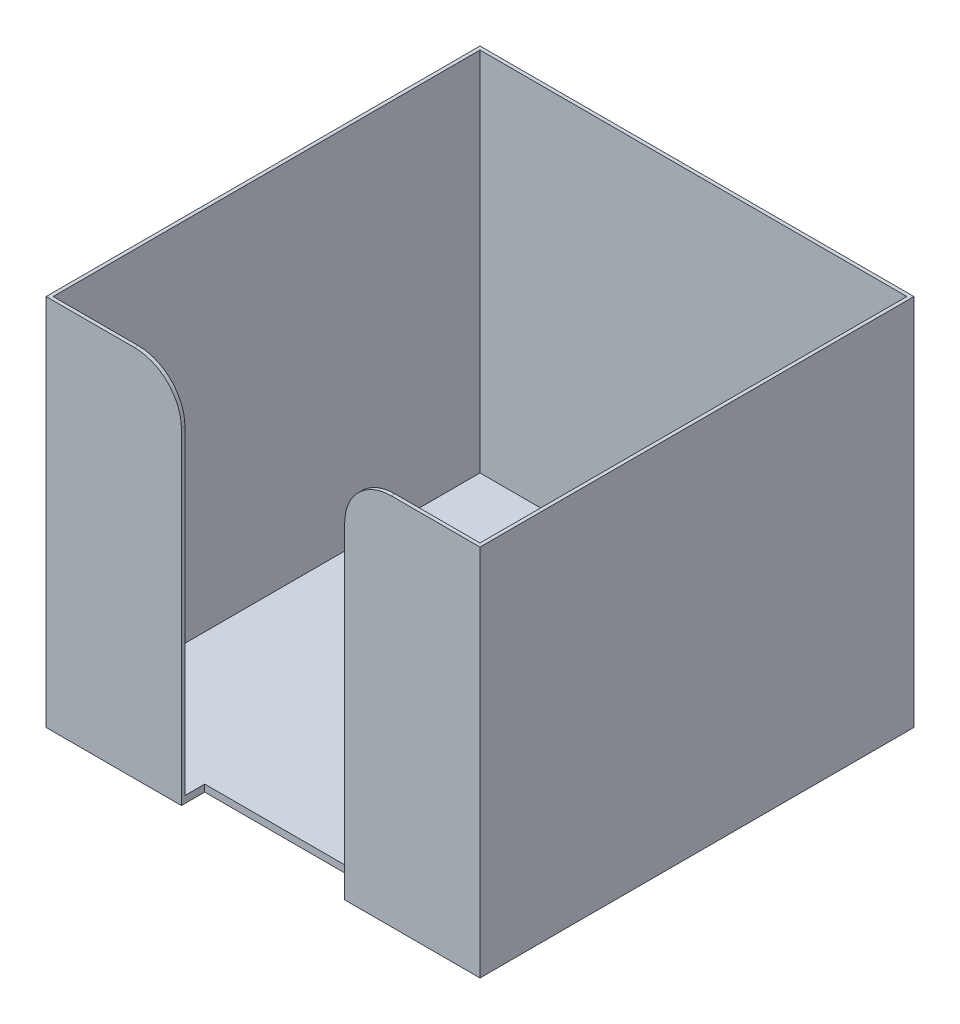
ISO-10303-21;
HEADER;
FILE_DESCRIPTION(('STEP AP214'),'2;1');
FILE_NAME('part.step','',(''),(''),'','','');
FILE_SCHEMA(('AUTOMOTIVE_DESIGN { 1 0 10303 214 1 1 1 1 }'));
ENDSEC;
DATA;
#1=APPLICATION_CONTEXT('core data for automotive mechanical design processes');
#2=APPLICATION_PROTOCOL_DEFINITION('international standard','automotive_design',2000,#1);
#3=PRODUCT_CONTEXT('',#1,'mechanical');
#4=PRODUCT('Part','Part','',(#3));
#5=PRODUCT_RELATED_PRODUCT_CATEGORY('part','',(#4));
#6=PRODUCT_DEFINITION_FORMATION('','',#4);
#7=PRODUCT_DEFINITION_CONTEXT('part definition',#1,'design');
#8=PRODUCT_DEFINITION('design','',#6,#7);
#9=PRODUCT_DEFINITION_SHAPE('','',#8);
#10=(LENGTH_UNIT() NAMED_UNIT(*) SI_UNIT(.MILLI.,.METRE.));
#11=(NAMED_UNIT(*) PLANE_ANGLE_UNIT() SI_UNIT($,.RADIAN.));
#12=(NAMED_UNIT(*) SI_UNIT($,.STERADIAN.) SOLID_ANGLE_UNIT());
#13=UNCERTAINTY_MEASURE_WITH_UNIT(LENGTH_MEASURE(1.E-05),#10,'distance_accuracy_value','');
#14=(GEOMETRIC_REPRESENTATION_CONTEXT(3) GLOBAL_UNCERTAINTY_ASSIGNED_CONTEXT((#13)) GLOBAL_UNIT_ASSIGNED_CONTEXT((#10,
#11,#12)) REPRESENTATION_CONTEXT('',''));
#15=CARTESIAN_POINT('',(0.,0.,0.));
#16=DIRECTION('',(0.,0.,1.));
#17=DIRECTION('',(1.,0.,0.));
#18=AXIS2_PLACEMENT_3D('',#15,#16,#17);
#19=CARTESIAN_POINT('',(-46.5,80.,46.5));
#20=DIRECTION('',(0.,0.,-1.));
#21=DIRECTION('',(-1.,0.,0.));
#22=AXIS2_PLACEMENT_3D('',#19,#20,#21);
#23=PLANE('',#22);
#24=DIRECTION('',(0.,-1.,0.));
#25=VECTOR('',#24,1.);
#26=CARTESIAN_POINT('',(-17.5,80.,46.5));
#27=LINE('',#26,#25);
#28=CARTESIAN_POINT('',(-17.5,70.,46.5));
#29=VERTEX_POINT('',#28);
#30=CARTESIAN_POINT('',(-17.5,0.,46.5));
#31=VERTEX_POINT('',#30);
#32=EDGE_CURVE('E172',#29,#31,#27,.T.);
#33=ORIENTED_EDGE('',*,*,#32,.F.);
#34=CARTESIAN_POINT('',(-27.5,70.,46.5));
#35=DIRECTION('',(0.,0.,-1.));
#36=DIRECTION('',(-1.,0.,0.));
#37=AXIS2_PLACEMENT_3D('',#34,#35,#36);
#38=CIRCLE('',#37,10.);
#39=CARTESIAN_POINT('',(-27.5,80.,46.5));
#40=VERTEX_POINT('',#39);
#41=EDGE_CURVE('E303',#29,#40,#38,.F.);
#42=ORIENTED_EDGE('',*,*,#41,.T.);
#43=DIRECTION('',(1.,0.,0.));
#44=VECTOR('',#43,1.);
#45=CARTESIAN_POINT('',(-46.5,80.,46.5));
#46=LINE('',#45,#44);
#47=CARTESIAN_POINT('',(-46.5,80.,46.5));
#48=VERTEX_POINT('',#47);
#49=EDGE_CURVE('E247',#48,#40,#46,.T.);
#50=ORIENTED_EDGE('',*,*,#49,.F.);
#51=DIRECTION('',(0.,-1.,0.));
#52=VECTOR('',#51,1.);
#53=CARTESIAN_POINT('',(-46.5,80.,46.5));
#54=LINE('',#53,#52);
#55=CARTESIAN_POINT('',(-46.5,0.,46.5));
#56=VERTEX_POINT('',#55);
#57=EDGE_CURVE('E263',#48,#56,#54,.T.);
#58=ORIENTED_EDGE('',*,*,#57,.T.);
#59=DIRECTION('',(1.,0.,0.));
#60=VECTOR('',#59,1.);
#61=CARTESIAN_POINT('',(-46.5,0.,46.5));
#62=LINE('',#61,#60);
#63=EDGE_CURVE('E264',#56,#31,#62,.T.);
#64=ORIENTED_EDGE('',*,*,#63,.T.);
#65=EDGE_LOOP('',(#33,#42,#50,#58,#64));
#66=FACE_BOUND('',#65,.T.);
#67=ADVANCED_FACE('F39',(#66),#23,.F.);
#68=CARTESIAN_POINT('',(45.75,1.5,45.75));
#69=DIRECTION('',(0.,0.,1.));
#70=DIRECTION('',(1.,0.,0.));
#71=AXIS2_PLACEMENT_3D('',#68,#69,#70);
#72=PLANE('',#71);
#73=DIRECTION('',(1.,0.,0.));
#74=VECTOR('',#73,1.);
#75=CARTESIAN_POINT('',(45.75,80.,45.75));
#76=LINE('',#75,#74);
#77=CARTESIAN_POINT('',(-45.75,80.,45.75));
#78=VERTEX_POINT('',#77);
#79=CARTESIAN_POINT('',(-27.5,80.,45.75));
#80=VERTEX_POINT('',#79);
#81=EDGE_CURVE('E222',#78,#80,#76,.T.);
#82=ORIENTED_EDGE('',*,*,#81,.T.);
#83=CARTESIAN_POINT('',(-27.5,70.,45.75));
#84=DIRECTION('',(0.,0.,1.));
#85=DIRECTION('',(1.,0.,0.));
#86=AXIS2_PLACEMENT_3D('',#83,#84,#85);
#87=CIRCLE('',#86,10.);
#88=CARTESIAN_POINT('',(-17.5,70.,45.75));
#89=VERTEX_POINT('',#88);
#90=EDGE_CURVE('E309',#80,#89,#87,.F.);
#91=ORIENTED_EDGE('',*,*,#90,.T.);
#92=DIRECTION('',(0.,-1.,0.));
#93=VECTOR('',#92,1.);
#94=CARTESIAN_POINT('',(-17.5,1.49999999999999,45.75));
#95=LINE('',#94,#93);
#96=CARTESIAN_POINT('',(-17.5,1.5,45.75));
#97=VERTEX_POINT('',#96);
#98=EDGE_CURVE('E196',#89,#97,#95,.T.);
#99=ORIENTED_EDGE('',*,*,#98,.T.);
#100=DIRECTION('',(1.,0.,0.));
#101=VECTOR('',#100,1.);
#102=CARTESIAN_POINT('',(45.75,1.5,45.75));
#103=LINE('',#102,#101);
#104=CARTESIAN_POINT('',(-45.75,1.5,45.75));
#105=VERTEX_POINT('',#104);
#106=EDGE_CURVE('E206',#105,#97,#103,.T.);
#107=ORIENTED_EDGE('',*,*,#106,.F.);
#108=DIRECTION('',(0.,1.,0.));
#109=VECTOR('',#108,1.);
#110=CARTESIAN_POINT('',(-45.75,1.5,45.75));
#111=LINE('',#110,#109);
#112=EDGE_CURVE('E218',#105,#78,#111,.T.);
#113=ORIENTED_EDGE('',*,*,#112,.T.);
#114=EDGE_LOOP('',(#82,#91,#99,#107,#113));
#115=FACE_BOUND('',#114,.T.);
#116=ADVANCED_FACE('F368',(#115),#72,.F.);
#117=CARTESIAN_POINT('',(27.5,80.,46.5));
#118=VERTEX_POINT('',#117);
#119=CARTESIAN_POINT('',(46.5,80.,46.5));
#120=VERTEX_POINT('',#119);
#121=EDGE_CURVE('E252',#118,#120,#46,.T.);
#122=ORIENTED_EDGE('',*,*,#121,.F.);
#123=CARTESIAN_POINT('',(27.5,70.,46.5));
#124=DIRECTION('',(0.,0.,-1.));
#125=DIRECTION('',(-1.,0.,0.));
#126=AXIS2_PLACEMENT_3D('',#123,#124,#125);
#127=CIRCLE('',#126,10.);
#128=CARTESIAN_POINT('',(17.5,70.,46.5));
#129=VERTEX_POINT('',#128);
#130=EDGE_CURVE('E62',#118,#129,#127,.F.);
#131=ORIENTED_EDGE('',*,*,#130,.T.);
#132=DIRECTION('',(0.,1.,0.));
#133=VECTOR('',#132,1.);
#134=CARTESIAN_POINT('',(17.5,80.,46.5));
#135=LINE('',#134,#133);
#136=CARTESIAN_POINT('',(17.5,0.,46.5));
#137=VERTEX_POINT('',#136);
#138=EDGE_CURVE('E164',#137,#129,#135,.T.);
#139=ORIENTED_EDGE('',*,*,#138,.F.);
#140=CARTESIAN_POINT('',(46.5,0.,46.5));
#141=VERTEX_POINT('',#140);
#142=EDGE_CURVE('E236',#137,#141,#62,.T.);
#143=ORIENTED_EDGE('',*,*,#142,.T.);
#144=DIRECTION('',(0.,-1.,0.));
#145=VECTOR('',#144,1.);
#146=CARTESIAN_POINT('',(46.5,80.,46.5));
#147=LINE('',#146,#145);
#148=EDGE_CURVE('E287',#120,#141,#147,.T.);
#149=ORIENTED_EDGE('',*,*,#148,.F.);
#150=EDGE_LOOP('',(#122,#131,#139,#143,#149));
#151=FACE_BOUND('',#150,.T.);
#152=ADVANCED_FACE('F348',(#151),#23,.F.);
#153=CARTESIAN_POINT('',(46.5,80.,46.5));
#154=DIRECTION('',(-1.,0.,0.));
#155=DIRECTION('',(0.,0.,1.));
#156=AXIS2_PLACEMENT_3D('',#153,#154,#155);
#157=PLANE('',#156);
#158=DIRECTION('',(0.,0.,-1.));
#159=VECTOR('',#158,1.);
#160=CARTESIAN_POINT('',(46.5,0.,46.5));
#161=LINE('',#160,#159);
#162=CARTESIAN_POINT('',(46.5,0.,-46.5));
#163=VERTEX_POINT('',#162);
#164=EDGE_CURVE('E267',#141,#163,#161,.T.);
#165=ORIENTED_EDGE('',*,*,#164,.T.);
#166=DIRECTION('',(0.,-1.,0.));
#167=VECTOR('',#166,1.);
#168=CARTESIAN_POINT('',(46.5,80.,-46.5));
#169=LINE('',#168,#167);
#170=CARTESIAN_POINT('',(46.5,80.,-46.5));
#171=VERTEX_POINT('',#170);
#172=EDGE_CURVE('E284',#171,#163,#169,.T.);
#173=ORIENTED_EDGE('',*,*,#172,.F.);
#174=DIRECTION('',(0.,0.,-1.));
#175=VECTOR('',#174,1.);
#176=CARTESIAN_POINT('',(46.5,80.,46.5));
#177=LINE('',#176,#175);
#178=EDGE_CURVE('E251',#120,#171,#177,.T.);
#179=ORIENTED_EDGE('',*,*,#178,.F.);
#180=ORIENTED_EDGE('',*,*,#148,.T.);
#181=EDGE_LOOP('',(#165,#173,#179,#180));
#182=FACE_BOUND('',#181,.T.);
#183=ADVANCED_FACE('F351',(#182),#157,.F.);
#184=CARTESIAN_POINT('',(-46.5,80.,-46.5));
#185=DIRECTION('',(0.,0.,-1.));
#186=DIRECTION('',(-1.,0.,0.));
#187=AXIS2_PLACEMENT_3D('',#184,#185,#186);
#188=PLANE('',#187);
#189=DIRECTION('',(1.,0.,0.));
#190=VECTOR('',#189,1.);
#191=CARTESIAN_POINT('',(-46.5,0.,-46.5));
#192=LINE('',#191,#190);
#193=CARTESIAN_POINT('',(-46.5,0.,-46.5));
#194=VERTEX_POINT('',#193);
#195=EDGE_CURVE('E271',#194,#163,#192,.T.);
#196=ORIENTED_EDGE('',*,*,#195,.F.);
#197=DIRECTION('',(0.,-1.,0.));
#198=VECTOR('',#197,1.);
#199=CARTESIAN_POINT('',(-46.5,80.,-46.5));
#200=LINE('',#199,#198);
#201=CARTESIAN_POINT('',(-46.5,80.,-46.5));
#202=VERTEX_POINT('',#201);
#203=EDGE_CURVE('E281',#202,#194,#200,.T.);
#204=ORIENTED_EDGE('',*,*,#203,.F.);
#205=DIRECTION('',(1.,0.,0.));
#206=VECTOR('',#205,1.);
#207=CARTESIAN_POINT('',(-46.5,80.,-46.5));
#208=LINE('',#207,#206);
#209=EDGE_CURVE('E255',#202,#171,#208,.T.);
#210=ORIENTED_EDGE('',*,*,#209,.T.);
#211=ORIENTED_EDGE('',*,*,#172,.T.);
#212=EDGE_LOOP('',(#196,#204,#210,#211));
#213=FACE_BOUND('',#212,.T.);
#214=ADVANCED_FACE('F392',(#213),#188,.T.);
#215=CARTESIAN_POINT('',(-46.5,80.,46.5));
#216=DIRECTION('',(-1.,0.,0.));
#217=DIRECTION('',(0.,0.,1.));
#218=AXIS2_PLACEMENT_3D('',#215,#216,#217);
#219=PLANE('',#218);
#220=DIRECTION('',(0.,0.,-1.));
#221=VECTOR('',#220,1.);
#222=CARTESIAN_POINT('',(-46.5,0.,46.5));
#223=LINE('',#222,#221);
#224=EDGE_CURVE('E275',#56,#194,#223,.T.);
#225=ORIENTED_EDGE('',*,*,#224,.F.);
#226=ORIENTED_EDGE('',*,*,#57,.F.);
#227=DIRECTION('',(0.,0.,-1.));
#228=VECTOR('',#227,1.);
#229=CARTESIAN_POINT('',(-46.5,80.,46.5));
#230=LINE('',#229,#228);
#231=EDGE_CURVE('E259',#48,#202,#230,.T.);
#232=ORIENTED_EDGE('',*,*,#231,.T.);
#233=ORIENTED_EDGE('',*,*,#203,.T.);
#234=EDGE_LOOP('',(#225,#226,#232,#233));
#235=FACE_BOUND('',#234,.T.);
#236=ADVANCED_FACE('F358',(#235),#219,.T.);
#237=CARTESIAN_POINT('',(0.,80.,0.));
#238=DIRECTION('',(0.,1.,0.));
#239=DIRECTION('',(0.,0.,1.));
#240=AXIS2_PLACEMENT_3D('',#237,#238,#239);
#241=PLANE('',#240);
#242=CARTESIAN_POINT('',(27.5,80.,45.75));
#243=VERTEX_POINT('',#242);
#244=CARTESIAN_POINT('',(45.75,80.,45.75));
#245=VERTEX_POINT('',#244);
#246=EDGE_CURVE('E221',#243,#245,#76,.T.);
#247=ORIENTED_EDGE('',*,*,#246,.F.);
#248=DIRECTION('',(0.,0.,1.));
#249=VECTOR('',#248,1.);
#250=CARTESIAN_POINT('',(27.5,80.,46.5));
#251=LINE('',#250,#249);
#252=EDGE_CURVE('E312',#243,#118,#251,.T.);
#253=ORIENTED_EDGE('',*,*,#252,.T.);
#254=ORIENTED_EDGE('',*,*,#121,.T.);
#255=ORIENTED_EDGE('',*,*,#178,.T.);
#256=ORIENTED_EDGE('',*,*,#209,.F.);
#257=ORIENTED_EDGE('',*,*,#231,.F.);
#258=ORIENTED_EDGE('',*,*,#49,.T.);
#259=DIRECTION('',(0.,0.,1.));
#260=VECTOR('',#259,1.);
#261=CARTESIAN_POINT('',(-27.5,80.,45.75));
#262=LINE('',#261,#260);
#263=EDGE_CURVE('E306',#40,#80,#262,.F.);
#264=ORIENTED_EDGE('',*,*,#263,.T.);
#265=ORIENTED_EDGE('',*,*,#81,.F.);
#266=DIRECTION('',(0.,0.,1.));
#267=VECTOR('',#266,1.);
#268=CARTESIAN_POINT('',(-45.75,80.,45.75));
#269=LINE('',#268,#267);
#270=CARTESIAN_POINT('',(-45.75,80.,-45.75));
#271=VERTEX_POINT('',#270);
#272=EDGE_CURVE('E199',#271,#78,#269,.T.);
#273=ORIENTED_EDGE('',*,*,#272,.F.);
#274=DIRECTION('',(-1.,0.,0.));
#275=VECTOR('',#274,1.);
#276=CARTESIAN_POINT('',(45.75,80.,-45.75));
#277=LINE('',#276,#275);
#278=CARTESIAN_POINT('',(45.75,80.,-45.75));
#279=VERTEX_POINT('',#278);
#280=EDGE_CURVE('E205',#279,#271,#277,.T.);
#281=ORIENTED_EDGE('',*,*,#280,.F.);
#282=DIRECTION('',(0.,0.,-1.));
#283=VECTOR('',#282,1.);
#284=CARTESIAN_POINT('',(45.75,80.,45.75));
#285=LINE('',#284,#283);
#286=EDGE_CURVE('E226',#245,#279,#285,.T.);
#287=ORIENTED_EDGE('',*,*,#286,.F.);
#288=EDGE_LOOP('',(#247,#253,#254,#255,#256,#257,#258,#264,#265,#273,#281,#287));
#289=FACE_BOUND('',#288,.T.);
#290=ADVANCED_FACE('F335',(#289),#241,.T.);
#291=CARTESIAN_POINT('',(0.,0.,0.));
#292=DIRECTION('',(0.,1.,0.));
#293=DIRECTION('',(0.,0.,1.));
#294=AXIS2_PLACEMENT_3D('',#291,#292,#293);
#295=PLANE('',#294);
#296=DIRECTION('',(1.,0.,0.));
#297=VECTOR('',#296,1.);
#298=CARTESIAN_POINT('',(-17.5,0.,41.5));
#299=LINE('',#298,#297);
#300=CARTESIAN_POINT('',(-17.5,0.,41.5));
#301=VERTEX_POINT('',#300);
#302=CARTESIAN_POINT('',(17.5,0.,41.5));
#303=VERTEX_POINT('',#302);
#304=EDGE_CURVE('E156',#301,#303,#299,.T.);
#305=ORIENTED_EDGE('',*,*,#304,.F.);
#306=DIRECTION('',(0.,0.,1.));
#307=VECTOR('',#306,1.);
#308=CARTESIAN_POINT('',(-17.5,0.,41.5));
#309=LINE('',#308,#307);
#310=EDGE_CURVE('E167',#301,#31,#309,.T.);
#311=ORIENTED_EDGE('',*,*,#310,.T.);
#312=ORIENTED_EDGE('',*,*,#63,.F.);
#313=ORIENTED_EDGE('',*,*,#224,.T.);
#314=ORIENTED_EDGE('',*,*,#195,.T.);
#315=ORIENTED_EDGE('',*,*,#164,.F.);
#316=ORIENTED_EDGE('',*,*,#142,.F.);
#317=DIRECTION('',(0.,0.,1.));
#318=VECTOR('',#317,1.);
#319=CARTESIAN_POINT('',(17.5,0.,41.5));
#320=LINE('',#319,#318);
#321=EDGE_CURVE('E177',#303,#137,#320,.T.);
#322=ORIENTED_EDGE('',*,*,#321,.F.);
#323=EDGE_LOOP('',(#305,#311,#312,#313,#314,#315,#316,#322));
#324=FACE_BOUND('',#323,.T.);
#325=ADVANCED_FACE('F180',(#324),#295,.F.);
#326=CARTESIAN_POINT('',(-45.75,1.5,45.75));
#327=DIRECTION('',(-1.,0.,0.));
#328=DIRECTION('',(0.,0.,1.));
#329=AXIS2_PLACEMENT_3D('',#326,#327,#328);
#330=PLANE('',#329);
#331=ORIENTED_EDGE('',*,*,#272,.T.);
#332=ORIENTED_EDGE('',*,*,#112,.F.);
#333=DIRECTION('',(0.,0.,1.));
#334=VECTOR('',#333,1.);
#335=CARTESIAN_POINT('',(-45.75,1.5,45.75));
#336=LINE('',#335,#334);
#337=CARTESIAN_POINT('',(-45.75,1.5,-45.75));
#338=VERTEX_POINT('',#337);
#339=EDGE_CURVE('E200',#338,#105,#336,.T.);
#340=ORIENTED_EDGE('',*,*,#339,.F.);
#341=DIRECTION('',(0.,1.,0.));
#342=VECTOR('',#341,1.);
#343=CARTESIAN_POINT('',(-45.75,1.5,-45.75));
#344=LINE('',#343,#342);
#345=EDGE_CURVE('E233',#338,#271,#344,.T.);
#346=ORIENTED_EDGE('',*,*,#345,.T.);
#347=EDGE_LOOP('',(#331,#332,#340,#346));
#348=FACE_BOUND('',#347,.T.);
#349=ADVANCED_FACE('F371',(#348),#330,.F.);
#350=CARTESIAN_POINT('',(45.75,1.5,-45.75));
#351=DIRECTION('',(0.,0.,-1.));
#352=DIRECTION('',(-1.,0.,0.));
#353=AXIS2_PLACEMENT_3D('',#350,#351,#352);
#354=PLANE('',#353);
#355=ORIENTED_EDGE('',*,*,#280,.T.);
#356=ORIENTED_EDGE('',*,*,#345,.F.);
#357=DIRECTION('',(-1.,0.,0.));
#358=VECTOR('',#357,1.);
#359=CARTESIAN_POINT('',(45.75,1.5,-45.75));
#360=LINE('',#359,#358);
#361=CARTESIAN_POINT('',(45.75,1.5,-45.75));
#362=VERTEX_POINT('',#361);
#363=EDGE_CURVE('E214',#362,#338,#360,.T.);
#364=ORIENTED_EDGE('',*,*,#363,.F.);
#365=DIRECTION('',(0.,1.,0.));
#366=VECTOR('',#365,1.);
#367=CARTESIAN_POINT('',(45.75,1.5,-45.75));
#368=LINE('',#367,#366);
#369=EDGE_CURVE('E237',#362,#279,#368,.T.);
#370=ORIENTED_EDGE('',*,*,#369,.T.);
#371=EDGE_LOOP('',(#355,#356,#364,#370));
#372=FACE_BOUND('',#371,.T.);
#373=ADVANCED_FACE('F339',(#372),#354,.F.);
#374=CARTESIAN_POINT('',(45.75,1.5,45.75));
#375=DIRECTION('',(1.,0.,0.));
#376=DIRECTION('',(0.,0.,-1.));
#377=AXIS2_PLACEMENT_3D('',#374,#375,#376);
#378=PLANE('',#377);
#379=ORIENTED_EDGE('',*,*,#286,.T.);
#380=ORIENTED_EDGE('',*,*,#369,.F.);
#381=DIRECTION('',(0.,0.,-1.));
#382=VECTOR('',#381,1.);
#383=CARTESIAN_POINT('',(45.75,1.5,45.75));
#384=LINE('',#383,#382);
#385=CARTESIAN_POINT('',(45.75,1.5,45.75));
#386=VERTEX_POINT('',#385);
#387=EDGE_CURVE('E210',#386,#362,#384,.T.);
#388=ORIENTED_EDGE('',*,*,#387,.F.);
#389=DIRECTION('',(0.,1.,0.));
#390=VECTOR('',#389,1.);
#391=CARTESIAN_POINT('',(45.75,1.5,45.75));
#392=LINE('',#391,#390);
#393=EDGE_CURVE('E240',#386,#245,#392,.T.);
#394=ORIENTED_EDGE('',*,*,#393,.T.);
#395=EDGE_LOOP('',(#379,#380,#388,#394));
#396=FACE_BOUND('',#395,.T.);
#397=ADVANCED_FACE('F333',(#396),#378,.F.);
#398=DIRECTION('',(0.,1.,0.));
#399=VECTOR('',#398,1.);
#400=CARTESIAN_POINT('',(17.5,1.5,45.75));
#401=LINE('',#400,#399);
#402=CARTESIAN_POINT('',(17.5,1.5,45.75));
#403=VERTEX_POINT('',#402);
#404=CARTESIAN_POINT('',(17.5,70.,45.75));
#405=VERTEX_POINT('',#404);
#406=EDGE_CURVE('E192',#403,#405,#401,.T.);
#407=ORIENTED_EDGE('',*,*,#406,.T.);
#408=CARTESIAN_POINT('',(27.5,70.,45.75));
#409=DIRECTION('',(0.,0.,1.));
#410=DIRECTION('',(1.,0.,0.));
#411=AXIS2_PLACEMENT_3D('',#408,#409,#410);
#412=CIRCLE('',#411,10.);
#413=EDGE_CURVE('E11',#405,#243,#412,.F.);
#414=ORIENTED_EDGE('',*,*,#413,.T.);
#415=ORIENTED_EDGE('',*,*,#246,.T.);
#416=ORIENTED_EDGE('',*,*,#393,.F.);
#417=EDGE_CURVE('E204',#403,#386,#103,.T.);
#418=ORIENTED_EDGE('',*,*,#417,.F.);
#419=EDGE_LOOP('',(#407,#414,#415,#416,#418));
#420=FACE_BOUND('',#419,.T.);
#421=ADVANCED_FACE('F325',(#420),#72,.F.);
#422=CARTESIAN_POINT('',(0.,1.5,0.));
#423=DIRECTION('',(0.,1.,0.));
#424=DIRECTION('',(0.,0.,1.));
#425=AXIS2_PLACEMENT_3D('',#422,#423,#424);
#426=PLANE('',#425);
#427=DIRECTION('',(0.,0.,1.));
#428=VECTOR('',#427,1.);
#429=CARTESIAN_POINT('',(-17.5,1.5,0.));
#430=LINE('',#429,#428);
#431=CARTESIAN_POINT('',(-17.5,1.5,41.5));
#432=VERTEX_POINT('',#431);
#433=EDGE_CURVE('E297',#432,#97,#430,.T.);
#434=ORIENTED_EDGE('',*,*,#433,.F.);
#435=DIRECTION('',(1.,0.,0.));
#436=VECTOR('',#435,1.);
#437=CARTESIAN_POINT('',(0.,1.5,41.5));
#438=LINE('',#437,#436);
#439=CARTESIAN_POINT('',(17.5,1.5,41.5));
#440=VERTEX_POINT('',#439);
#441=EDGE_CURVE('E159',#432,#440,#438,.T.);
#442=ORIENTED_EDGE('',*,*,#441,.T.);
#443=DIRECTION('',(0.,0.,-1.));
#444=VECTOR('',#443,1.);
#445=CARTESIAN_POINT('',(17.5,1.5,0.));
#446=LINE('',#445,#444);
#447=EDGE_CURVE('E293',#403,#440,#446,.T.);
#448=ORIENTED_EDGE('',*,*,#447,.F.);
#449=ORIENTED_EDGE('',*,*,#417,.T.);
#450=ORIENTED_EDGE('',*,*,#387,.T.);
#451=ORIENTED_EDGE('',*,*,#363,.T.);
#452=ORIENTED_EDGE('',*,*,#339,.T.);
#453=ORIENTED_EDGE('',*,*,#106,.T.);
#454=EDGE_LOOP('',(#434,#442,#448,#449,#450,#451,#452,#453));
#455=FACE_BOUND('',#454,.T.);
#456=ADVANCED_FACE('F343',(#455),#426,.T.);
#457=CARTESIAN_POINT('',(-17.5,80.,41.5));
#458=DIRECTION('',(-1.,0.,0.));
#459=DIRECTION('',(0.,-1.,0.));
#460=AXIS2_PLACEMENT_3D('',#457,#458,#459);
#461=PLANE('',#460);
#462=ORIENTED_EDGE('',*,*,#98,.F.);
#463=DIRECTION('',(0.,0.,1.));
#464=VECTOR('',#463,1.);
#465=CARTESIAN_POINT('',(-17.5,70.,46.5));
#466=LINE('',#465,#464);
#467=EDGE_CURVE('E300',#89,#29,#466,.T.);
#468=ORIENTED_EDGE('',*,*,#467,.T.);
#469=ORIENTED_EDGE('',*,*,#32,.T.);
#470=ORIENTED_EDGE('',*,*,#310,.F.);
#471=DIRECTION('',(0.,-1.,0.));
#472=VECTOR('',#471,1.);
#473=CARTESIAN_POINT('',(-17.5,80.,41.5));
#474=LINE('',#473,#472);
#475=EDGE_CURVE('E152',#432,#301,#474,.T.);
#476=ORIENTED_EDGE('',*,*,#475,.F.);
#477=ORIENTED_EDGE('',*,*,#433,.T.);
#478=EDGE_LOOP('',(#462,#468,#469,#470,#476,#477));
#479=FACE_BOUND('',#478,.T.);
#480=ADVANCED_FACE('F169',(#479),#461,.F.);
#481=CARTESIAN_POINT('',(17.5,80.,41.5));
#482=DIRECTION('',(1.,0.,0.));
#483=DIRECTION('',(0.,1.,0.));
#484=AXIS2_PLACEMENT_3D('',#481,#482,#483);
#485=PLANE('',#484);
#486=ORIENTED_EDGE('',*,*,#138,.T.);
#487=DIRECTION('',(0.,0.,1.));
#488=VECTOR('',#487,1.);
#489=CARTESIAN_POINT('',(17.5,70.,45.75));
#490=LINE('',#489,#488);
#491=EDGE_CURVE('E48',#129,#405,#490,.F.);
#492=ORIENTED_EDGE('',*,*,#491,.T.);
#493=ORIENTED_EDGE('',*,*,#406,.F.);
#494=ORIENTED_EDGE('',*,*,#447,.T.);
#495=DIRECTION('',(0.,1.,0.));
#496=VECTOR('',#495,1.);
#497=CARTESIAN_POINT('',(17.5,80.,41.5));
#498=LINE('',#497,#496);
#499=EDGE_CURVE('E178',#303,#440,#498,.T.);
#500=ORIENTED_EDGE('',*,*,#499,.F.);
#501=ORIENTED_EDGE('',*,*,#321,.T.);
#502=EDGE_LOOP('',(#486,#492,#493,#494,#500,#501));
#503=FACE_BOUND('',#502,.T.);
#504=ADVANCED_FACE('F435',(#503),#485,.F.);
#505=CARTESIAN_POINT('',(0.,0.,41.5));
#506=DIRECTION('',(0.,0.,1.));
#507=DIRECTION('',(1.,0.,0.));
#508=AXIS2_PLACEMENT_3D('',#505,#506,#507);
#509=PLANE('',#508);
#510=ORIENTED_EDGE('',*,*,#475,.T.);
#511=ORIENTED_EDGE('',*,*,#304,.T.);
#512=ORIENTED_EDGE('',*,*,#499,.T.);
#513=ORIENTED_EDGE('',*,*,#441,.F.);
#514=EDGE_LOOP('',(#510,#511,#512,#513));
#515=FACE_BOUND('',#514,.T.);
#516=ADVANCED_FACE('F154',(#515),#509,.T.);
#517=CARTESIAN_POINT('',(-27.5,70.,41.5));
#518=DIRECTION('',(0.,0.,-1.));
#519=DIRECTION('',(-1.,0.,0.));
#520=AXIS2_PLACEMENT_3D('',#517,#518,#519);
#521=CYLINDRICAL_SURFACE('',#520,10.);
#522=ORIENTED_EDGE('',*,*,#90,.F.);
#523=ORIENTED_EDGE('',*,*,#263,.F.);
#524=ORIENTED_EDGE('',*,*,#41,.F.);
#525=ORIENTED_EDGE('',*,*,#467,.F.);
#526=EDGE_LOOP('',(#522,#523,#524,#525));
#527=FACE_BOUND('',#526,.T.);
#528=ADVANCED_FACE('F365',(#527),#521,.T.);
#529=CARTESIAN_POINT('',(27.5,70.,0.));
#530=DIRECTION('',(0.,0.,-1.));
#531=DIRECTION('',(-1.,0.,0.));
#532=AXIS2_PLACEMENT_3D('',#529,#530,#531);
#533=CYLINDRICAL_SURFACE('',#532,10.);
#534=ORIENTED_EDGE('',*,*,#413,.F.);
#535=ORIENTED_EDGE('',*,*,#491,.F.);
#536=ORIENTED_EDGE('',*,*,#130,.F.);
#537=ORIENTED_EDGE('',*,*,#252,.F.);
#538=EDGE_LOOP('',(#534,#535,#536,#537));
#539=FACE_BOUND('',#538,.T.);
#540=ADVANCED_FACE('F41',(#539),#533,.T.);
#541=CLOSED_SHELL('',(#67,#116,#152,#183,#214,#236,#290,#325,#349,#373,#397,#421,#456,#480,#504,
#516,#528,#540));
#542=MANIFOLD_SOLID_BREP('B2',#541);
#543=ADVANCED_BREP_SHAPE_REPRESENTATION('',(#18,#542),#14);
#544=SHAPE_DEFINITION_REPRESENTATION(#9,#543);
ENDSEC;
END-ISO-10303-21;
